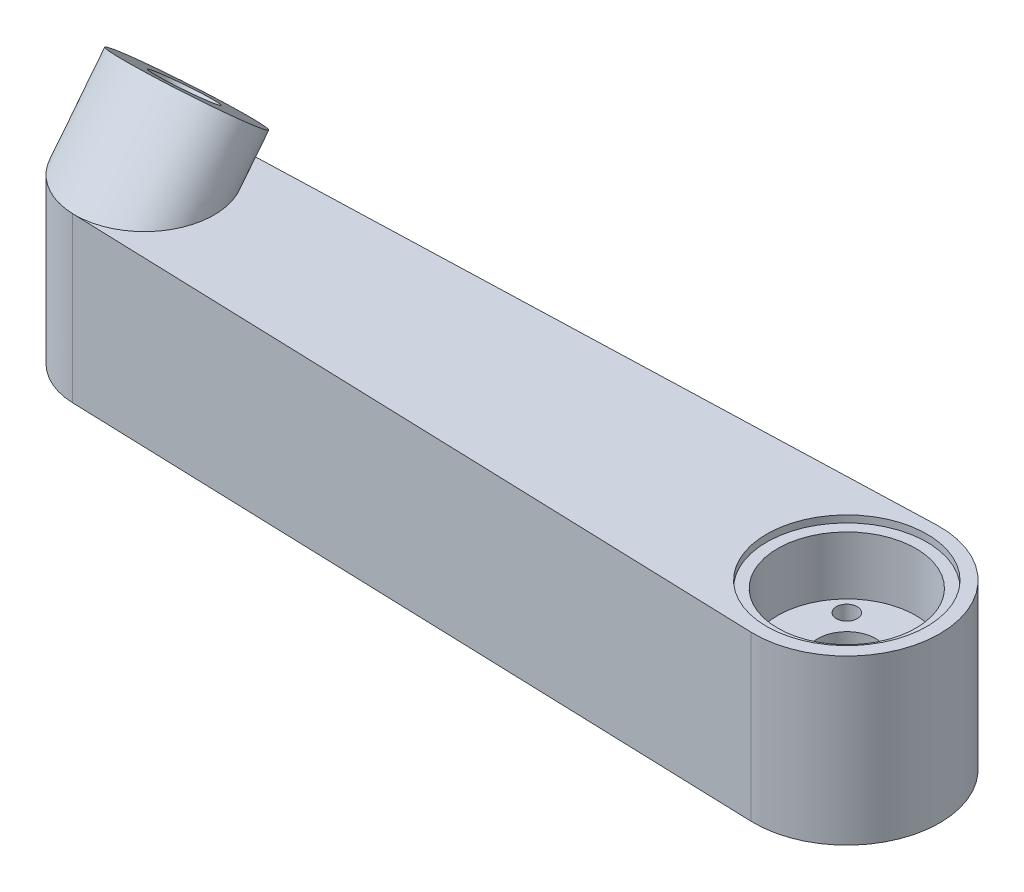
ISO-10303-21;
HEADER;
FILE_DESCRIPTION(('STEP AP214'),'2;1');
FILE_NAME('part.step','',(''),(''),'','','');
FILE_SCHEMA(('AUTOMOTIVE_DESIGN { 1 0 10303 214 1 1 1 1 }'));
ENDSEC;
DATA;
#1=APPLICATION_CONTEXT('core data for automotive mechanical design processes');
#2=APPLICATION_PROTOCOL_DEFINITION('international standard','automotive_design',2000,#1);
#3=PRODUCT_CONTEXT('',#1,'mechanical');
#4=PRODUCT('Part','Part','',(#3));
#5=PRODUCT_RELATED_PRODUCT_CATEGORY('part','',(#4));
#6=PRODUCT_DEFINITION_FORMATION('','',#4);
#7=PRODUCT_DEFINITION_CONTEXT('part definition',#1,'design');
#8=PRODUCT_DEFINITION('design','',#6,#7);
#9=PRODUCT_DEFINITION_SHAPE('','',#8);
#10=(LENGTH_UNIT() NAMED_UNIT(*) SI_UNIT(.MILLI.,.METRE.));
#11=(NAMED_UNIT(*) PLANE_ANGLE_UNIT() SI_UNIT($,.RADIAN.));
#12=(NAMED_UNIT(*) SI_UNIT($,.STERADIAN.) SOLID_ANGLE_UNIT());
#13=UNCERTAINTY_MEASURE_WITH_UNIT(LENGTH_MEASURE(1.E-05),#10,'distance_accuracy_value','');
#14=(GEOMETRIC_REPRESENTATION_CONTEXT(3) GLOBAL_UNCERTAINTY_ASSIGNED_CONTEXT((#13)) GLOBAL_UNIT_ASSIGNED_CONTEXT((#10,
#11,#12)) REPRESENTATION_CONTEXT('',''));
#15=CARTESIAN_POINT('',(0.,0.,0.));
#16=DIRECTION('',(0.,0.,1.));
#17=DIRECTION('',(1.,0.,0.));
#18=AXIS2_PLACEMENT_3D('',#15,#16,#17);
#19=CARTESIAN_POINT('',(-1.65047615234204,14.11,0.));
#20=DIRECTION('',(0.,1.,0.));
#21=DIRECTION('',(0.,0.,1.));
#22=AXIS2_PLACEMENT_3D('',#19,#20,#21);
#23=PLANE('',#22);
#24=CARTESIAN_POINT('',(-1.65047615234204,14.11,0.));
#25=DIRECTION('',(0.,1.,0.));
#26=DIRECTION('',(0.,0.,1.));
#27=AXIS2_PLACEMENT_3D('',#24,#25,#26);
#28=CIRCLE('',#27,6.9);
#29=CARTESIAN_POINT('',(-1.65047615234204,14.11,6.9));
#30=VERTEX_POINT('',#29);
#31=EDGE_CURVE('E247',#30,#30,#28,.T.);
#32=ORIENTED_EDGE('',*,*,#31,.F.);
#33=EDGE_LOOP('',(#32));
#34=FACE_BOUND('',#33,.T.);
#35=DIRECTION('',(-0.999453439871721,0.,0.0330578512396694));
#36=VECTOR('',#35,1.);
#37=CARTESIAN_POINT('',(-62.3488232597801,14.11,-5.99672063923033));
#38=LINE('',#37,#36);
#39=CARTESIAN_POINT('',(-1.91493896225939,14.11,-7.99562751897377));
#40=VERTEX_POINT('',#39);
#41=CARTESIAN_POINT('',(-62.3488232597801,14.11,-5.99672063923033));
#42=VERTEX_POINT('',#41);
#43=EDGE_CURVE('E147',#40,#42,#38,.T.);
#44=ORIENTED_EDGE('',*,*,#43,.T.);
#45=CARTESIAN_POINT('',(-68.1471967915724,14.11,0.198347107438119));
#46=CARTESIAN_POINT('',(-68.1520661843634,14.11,0.0511553282352562));
#47=CARTESIAN_POINT('',(-68.1515121963934,14.11,-0.0962002275383863));
#48=CARTESIAN_POINT('',(-68.1395691386214,14.11,-0.390426775860385));
#49=CARTESIAN_POINT('',(-68.1281838321258,14.11,-0.537297918931526));
#50=CARTESIAN_POINT('',(-68.0946434247732,14.11,-0.829778387416431));
#51=CARTESIAN_POINT('',(-68.0724906600901,14.11,-0.975387979572081));
#52=CARTESIAN_POINT('',(-68.0175300864817,14.11,-1.26467124292174));
#53=CARTESIAN_POINT('',(-67.9847139657775,14.11,-1.40834331259123));
#54=CARTESIAN_POINT('',(-67.8697041533749,14.11,-1.83817835365446));
#55=CARTESIAN_POINT('',(-67.7712908059994,14.11,-2.12017498374659));
#56=CARTESIAN_POINT('',(-67.5336703268179,14.11,-2.66645115116667));
#57=CARTESIAN_POINT('',(-67.3944575816791,14.11,-2.9307282444229));
#58=CARTESIAN_POINT('',(-67.1482842114118,14.11,-3.32410173548775));
#59=CARTESIAN_POINT('',(-67.054187176081,14.11,-3.46140238156312));
#60=CARTESIAN_POINT('',(-66.8549741393181,14.11,-3.72763925572838));
#61=CARTESIAN_POINT('',(-66.7498665988274,14.11,-3.8565817849798));
#62=CARTESIAN_POINT('',(-66.5292832151012,14.11,-4.10532561793325));
#63=CARTESIAN_POINT('',(-66.4138043852355,14.11,-4.22512426997322));
#64=CARTESIAN_POINT('',(-66.1732751266894,14.11,-4.45474300468774));
#65=CARTESIAN_POINT('',(-66.048222925387,14.11,-4.56456123109628));
#66=CARTESIAN_POINT('',(-65.7894660538042,14.11,-4.77340430217863));
#67=CARTESIAN_POINT('',(-65.6557637447259,14.11,-4.87243207265495));
#68=CARTESIAN_POINT('',(-65.3805496669889,14.11,-5.05907892826204));
#69=CARTESIAN_POINT('',(-65.2390351183588,14.11,-5.14669391442633));
#70=CARTESIAN_POINT('',(-64.9492702893459,14.11,-5.30983865826737));
#71=CARTESIAN_POINT('',(-64.801022441055,14.11,-5.38537273573363));
#72=CARTESIAN_POINT('',(-64.4987131340798,14.11,-5.5238969840342));
#73=CARTESIAN_POINT('',(-64.3446496083553,14.11,-5.58688264394521));
#74=CARTESIAN_POINT('',(-64.0318798855268,14.11,-5.69982062044537));
#75=CARTESIAN_POINT('',(-63.8731753737037,14.11,-5.74977760435157));
#76=CARTESIAN_POINT('',(-63.5521089639096,14.11,-5.83635847941514));
#77=CARTESIAN_POINT('',(-63.3897457738244,14.11,-5.87297757918927));
#78=CARTESIAN_POINT('',(-63.0625978046556,14.11,-5.9325938000603));
#79=CARTESIAN_POINT('',(-62.8978139152139,14.11,-5.95559580333154));
#80=CARTESIAN_POINT('',(-62.566845852174,14.11,-5.98784528141334));
#81=CARTESIAN_POINT('',(-62.4006611972648,14.11,-5.99708781703348));
#82=CARTESIAN_POINT('',(-62.068158169307,14.11,-6.00173798606311));
#83=CARTESIAN_POINT('',(-61.9018398656182,14.11,-5.99715058157522));
#84=CARTESIAN_POINT('',(-61.5700986984763,14.11,-5.97417917837395));
#85=CARTESIAN_POINT('',(-61.4046761778,14.11,-5.955790228925));
#86=CARTESIAN_POINT('',(-61.075988975103,14.11,-5.90534608631024));
#87=CARTESIAN_POINT('',(-60.9127235402447,14.11,-5.8732957982978));
#88=CARTESIAN_POINT('',(-60.5893591453957,14.11,-5.79573710332624));
#89=CARTESIAN_POINT('',(-60.4292613428185,14.11,-5.75022387064067));
#90=CARTESIAN_POINT('',(-60.1134555882603,14.11,-5.64607670806484));
#91=CARTESIAN_POINT('',(-59.9577460820183,14.11,-5.5874474911033));
#92=CARTESIAN_POINT('',(-59.6516773505297,14.11,-5.45744077659137));
#93=CARTESIAN_POINT('',(-59.5013200654482,14.11,-5.38605871148482));
#94=CARTESIAN_POINT('',(-59.2071058796659,14.11,-5.23108068300924));
#95=CARTESIAN_POINT('',(-59.0632466662931,14.11,-5.14748911058275));
#96=CARTESIAN_POINT('',(-58.7829162513688,14.11,-4.96862150448562));
#97=CARTESIAN_POINT('',(-58.6464477197579,14.11,-4.87334128825769));
#98=CARTESIAN_POINT('',(-58.381936712407,14.11,-4.67180179886411));
#99=CARTESIAN_POINT('',(-58.2538912313698,14.11,-4.56554647671548));
#100=CARTESIAN_POINT('',(-58.0070430313702,14.11,-4.34277041926882));
#101=CARTESIAN_POINT('',(-57.8882436459451,14.11,-4.22624601360094));
#102=CARTESIAN_POINT('',(-57.5470841944294,14.11,-3.8625139479802));
#103=CARTESIAN_POINT('',(-57.3396837459768,14.11,-3.60093441143771));
#104=CARTESIAN_POINT('',(-56.9711518602716,14.11,-3.04719076425182));
#105=CARTESIAN_POINT('',(-56.810020423019,14.11,-2.75502665360843));
#106=CARTESIAN_POINT('',(-56.5383023752105,14.11,-2.14802412058735));
#107=CARTESIAN_POINT('',(-56.4277157646547,14.11,-1.83318569820966));
#108=CARTESIAN_POINT('',(-56.2601826225626,14.11,-1.18955787510422));
#109=CARTESIAN_POINT('',(-56.2032360910264,14.11,-0.860768474376483));
#110=CARTESIAN_POINT('',(-56.1445416843908,14.11,-0.198296524990587));
#111=CARTESIAN_POINT('',(-56.1427938092914,14.11,0.135386023667567));
#112=CARTESIAN_POINT('',(-56.1945481419429,14.11,0.798438001954646));
#113=CARTESIAN_POINT('',(-56.2480503496936,14.11,1.12780743158357));
#114=CARTESIAN_POINT('',(-56.4088283991795,14.11,1.77314948413628));
#115=CARTESIAN_POINT('',(-56.5161042409146,14.11,2.08912210706006));
#116=CARTESIAN_POINT('',(-56.7814706685639,14.11,2.69895536711243));
#117=CARTESIAN_POINT('',(-56.939561254478,14.11,2.99281600424101));
#118=CARTESIAN_POINT('',(-57.3021979083071,14.11,3.55032034876061));
#119=CARTESIAN_POINT('',(-57.5067439762221,14.11,3.81396405615163));
#120=CARTESIAN_POINT('',(-57.9566456485289,14.11,4.30376258855954));
#121=CARTESIAN_POINT('',(-58.2020012529208,14.11,4.52991741357643));
#122=CARTESIAN_POINT('',(-58.7267708151678,14.11,4.93850159696324));
#123=CARTESIAN_POINT('',(-59.0061847730229,14.11,5.12093095533315));
#124=CARTESIAN_POINT('',(-59.5913044817909,14.11,5.4370285652733));
#125=CARTESIAN_POINT('',(-59.8970102327037,14.11,5.57069681684353));
#126=CARTESIAN_POINT('',(-60.5265054658597,14.11,5.78560035105036));
#127=CARTESIAN_POINT('',(-60.8502949481029,14.11,5.86683563368695));
#128=CARTESIAN_POINT('',(-61.3423890625995,14.11,5.94766984300878));
#129=CARTESIAN_POINT('',(-61.5075765237426,14.11,5.96777789549279));
#130=CARTESIAN_POINT('',(-61.8390344794966,14.11,5.99421327296285));
#131=CARTESIAN_POINT('',(-62.0053045643073,14.11,6.00054553921893));
#132=CARTESIAN_POINT('',(-62.3378446084273,14.11,5.9993802704831));
#133=CARTESIAN_POINT('',(-62.5041145462768,14.11,5.99187777143176));
#134=CARTESIAN_POINT('',(-62.835400445196,14.11,5.96309556825293));
#135=CARTESIAN_POINT('',(-63.0004168347325,14.11,5.94182080768531));
#136=CARTESIAN_POINT('',(-63.3281716804609,14.11,5.88563417647897));
#137=CARTESIAN_POINT('',(-63.4909092978939,14.11,5.85071741448976));
#138=CARTESIAN_POINT('',(-63.8128647161773,14.11,5.76750369657232));
#139=CARTESIAN_POINT('',(-63.9720837588227,14.11,5.71921154530358));
#140=CARTESIAN_POINT('',(-64.2860191393127,14.11,5.60955534188984));
#141=CARTESIAN_POINT('',(-64.4407338407194,14.11,5.54818660471913));
#142=CARTESIAN_POINT('',(-64.7444772951138,14.11,5.41283596044297));
#143=CARTESIAN_POINT('',(-64.89350806803,14.11,5.33885858622558));
#144=CARTESIAN_POINT('',(-65.1849656249351,14.11,5.17875742746718));
#145=CARTESIAN_POINT('',(-65.3273900197112,14.11,5.09262929338866));
#146=CARTESIAN_POINT('',(-65.6045437442249,14.11,4.90887483802792));
#147=CARTESIAN_POINT('',(-65.7392758161987,14.11,4.81125265274709));
#148=CARTESIAN_POINT('',(-66.0002167787745,14.11,4.60512235854356));
#149=CARTESIAN_POINT('',(-66.1264225936988,14.11,4.49661035604906));
#150=CARTESIAN_POINT('',(-66.3693423020739,14.11,4.26952029553528));
#151=CARTESIAN_POINT('',(-66.4860595835452,14.11,4.1509458616395));
#152=CARTESIAN_POINT('',(-66.7092867868678,14.11,3.90447183125185));
#153=CARTESIAN_POINT('',(-66.8157930393663,14.11,3.77656891140581));
#154=CARTESIAN_POINT('',(-67.0177786467934,14.11,3.51240685555703));
#155=CARTESIAN_POINT('',(-67.1132619261399,14.11,3.37615072009641));
#156=CARTESIAN_POINT('',(-67.2926173103556,14.11,3.09613262546256));
#157=CARTESIAN_POINT('',(-67.3764854474698,14.11,2.95236812439861));
#158=CARTESIAN_POINT('',(-67.5319656782743,14.11,2.65842226220991));
#159=CARTESIAN_POINT('',(-67.6035817361024,14.11,2.50824299629816));
#160=CARTESIAN_POINT('',(-67.7402861427434,14.11,2.1879536183892));
#161=CARTESIAN_POINT('',(-67.8041129676212,14.11,2.01730333890915));
#162=CARTESIAN_POINT('',(-67.915972755906,14.11,1.67097430308339));
#163=CARTESIAN_POINT('',(-67.9640111776156,14.11,1.49529730743443));
#164=CARTESIAN_POINT('',(-68.0453465853963,14.11,1.13401497162116));
#165=CARTESIAN_POINT('',(-68.0780613342867,14.11,0.948278345818862));
#166=CARTESIAN_POINT('',(-68.1258714925853,14.11,0.574565930804265));
#167=CARTESIAN_POINT('',(-68.1409693324027,14.11,0.386590454076896));
#168=CARTESIAN_POINT('',(-68.1471967915724,14.11,0.198347107438119));
#169=B_SPLINE_CURVE_WITH_KNOTS('',3,(#45,#46,#47,#48,#49,#50,#51,#52,#53,#54,#55,#56,#57,#58,
#59,#60,#61,#62,#63,#64,#65,#66,#67,#68,#69,#70,#71,#72,#73,#74,#75,#76,#77,#78,#79,#80,#81,#82,
#83,#84,#85,#86,#87,#88,#89,#90,#91,#92,#93,#94,#95,#96,#97,#98,#99,#100,#101,#102,#103,#104,
#105,#106,#107,#108,#109,#110,#111,#112,#113,#114,#115,#116,#117,#118,#119,#120,#121,#122,#123,
#124,#125,#126,#127,#128,#129,#130,#131,#132,#133,#134,#135,#136,#137,#138,#139,#140,#141,#142,
#143,#144,#145,#146,#147,#148,#149,#150,#151,#152,#153,#154,#155,#156,#157,#158,#159,#160,#161,
#162,#163,#164,#165,#166,#167,#168),.UNSPECIFIED.,.T.,.F.,(4,2,2,2,2,2,2,2,2,2,2,2,2,2,2,2,2,2,
2,2,2,2,2,2,2,2,2,2,2,2,2,2,2,2,2,2,2,2,2,2,2,2,2,2,2,2,2,2,2,2,2,2,2,2,2,2,2,2,2,2,2,4),(0.,
0.441689269997099,0.883225132523402,1.32466523945413,1.76645026497406,2.65894588078218,
3.55156434714494,4.05041444936177,4.54888398750575,5.04749753350187,5.5462036279825,
6.04477416140674,6.5435232684384,7.04209363632608,7.54084290889411,8.03941326624042,
8.53816254934972,9.03673290606388,9.53548218980527,10.0340525464842,10.5328018302608,
11.0313721869381,11.5301214707164,12.0286918273937,12.5274411111721,13.0260114678495,
13.5247607516279,14.0233311083048,14.5220803920838,15.5185385663628,16.5149967406417,
17.5114549149206,18.5079130891995,19.5043712634784,20.5008294377574,21.4972876120363,
22.4937457863152,23.4902039605941,24.486662134873,25.483120309152,26.4795784834309,
27.4760366577098,27.9747859414888,28.4733562981653,28.9721055819434,29.4706759386209,
29.9694252223934,30.4679955790765,30.9667448627544,31.4653152195322,31.9640645016595,
32.462634859988,32.9613841178076,33.4599545004439,33.9587033789885,34.4572741409001,
34.9560147976635,35.454593781361,36.0004152538649,36.5460478282145,37.111001525695,
37.6758772735729),.UNSPECIFIED.);
#170=CARTESIAN_POINT('',(-62.3488232597801,14.11,5.99672063923033));
#171=VERTEX_POINT('',#170);
#172=EDGE_CURVE('E146',#42,#171,#169,.T.);
#173=ORIENTED_EDGE('',*,*,#172,.T.);
#174=DIRECTION('',(0.999453439871721,0.,0.0330578512396694));
#175=VECTOR('',#174,1.);
#176=CARTESIAN_POINT('',(-62.3488232597801,14.11,5.99672063923033));
#177=LINE('',#176,#175);
#178=CARTESIAN_POINT('',(-1.9149389622594,14.11,7.99562751897377));
#179=VERTEX_POINT('',#178);
#180=EDGE_CURVE('E124',#171,#179,#177,.T.);
#181=ORIENTED_EDGE('',*,*,#180,.T.);
#182=CARTESIAN_POINT('',(-1.65047615234204,14.11,0.));
#183=DIRECTION('',(0.,1.,0.));
#184=DIRECTION('',(0.,0.,1.));
#185=AXIS2_PLACEMENT_3D('',#182,#183,#184);
#186=CIRCLE('',#185,8.);
#187=EDGE_CURVE('E156',#179,#40,#186,.T.);
#188=ORIENTED_EDGE('',*,*,#187,.T.);
#189=EDGE_LOOP('',(#44,#173,#181,#188));
#190=FACE_BOUND('',#189,.T.);
#191=ADVANCED_FACE('F33',(#34,#190),#23,.T.);
#192=CARTESIAN_POINT('',(-1.65047615234204,2.5,0.));
#193=DIRECTION('',(0.,-1.,0.));
#194=DIRECTION('',(0.,0.,-1.));
#195=AXIS2_PLACEMENT_3D('',#192,#193,#194);
#196=PLANE('',#195);
#197=CARTESIAN_POINT('',(-1.65047615234204,2.5,0.));
#198=DIRECTION('',(0.,-1.,0.));
#199=DIRECTION('',(0.,0.,-1.));
#200=AXIS2_PLACEMENT_3D('',#197,#198,#199);
#201=CIRCLE('',#200,2.5);
#202=CARTESIAN_POINT('',(0.757686140271016,2.5,-0.671382433815952));
#203=VERTEX_POINT('',#202);
#204=CARTESIAN_POINT('',(-3.78029224303496,2.5,-1.30915370366718));
#205=VERTEX_POINT('',#204);
#206=EDGE_CURVE('E182',#203,#205,#201,.F.);
#207=ORIENTED_EDGE('',*,*,#206,.T.);
#208=DIRECTION('',(0.99026806874157,0.,0.139173100960066));
#209=VECTOR('',#208,1.);
#210=CARTESIAN_POINT('',(-7.36980795271308,2.5,-1.8136272376827));
#211=LINE('',#210,#209);
#212=CARTESIAN_POINT('',(-7.36980795271308,2.5,-1.8136272376827));
#213=VERTEX_POINT('',#212);
#214=EDGE_CURVE('E150',#213,#205,#211,.T.);
#215=ORIENTED_EDGE('',*,*,#214,.F.);
#216=CARTESIAN_POINT('',(-1.65047615234204,2.5,0.));
#217=DIRECTION('',(0.,-1.,0.));
#218=DIRECTION('',(0.,0.,-1.));
#219=AXIS2_PLACEMENT_3D('',#216,#217,#218);
#220=CIRCLE('',#219,6.);
#221=CARTESIAN_POINT('',(4.34720184994913,2.5,-0.16690889980044));
#222=VERTEX_POINT('',#221);
#223=EDGE_CURVE('E263',#213,#222,#220,.T.);
#224=ORIENTED_EDGE('',*,*,#223,.T.);
#225=DIRECTION('',(0.99026806874157,0.,0.139173100960066));
#226=VECTOR('',#225,1.);
#227=CARTESIAN_POINT('',(0.757686140271016,2.5,-0.671382433815952));
#228=LINE('',#227,#226);
#229=EDGE_CURVE('E278',#203,#222,#228,.T.);
#230=ORIENTED_EDGE('',*,*,#229,.F.);
#231=EDGE_LOOP('',(#207,#215,#224,#230));
#232=FACE_BOUND('',#231,.T.);
#233=ADVANCED_FACE('F213',(#232),#196,.T.);
#234=CARTESIAN_POINT('',(4.068855648029,2.5,1.8136272376827));
#235=VERTEX_POINT('',#234);
#236=CARTESIAN_POINT('',(-7.64815415463321,2.5,0.166908899800477));
#237=VERTEX_POINT('',#236);
#238=EDGE_CURVE('E265',#235,#237,#220,.T.);
#239=ORIENTED_EDGE('',*,*,#238,.T.);
#240=DIRECTION('',(-0.990268068741571,0.,-0.139173100960063));
#241=VECTOR('',#240,1.);
#242=CARTESIAN_POINT('',(-7.64815415463321,2.5,0.166908899800477));
#243=LINE('',#242,#241);
#244=CARTESIAN_POINT('',(-4.05863844495509,2.5,0.67138243381598));
#245=VERTEX_POINT('',#244);
#246=EDGE_CURVE('E303',#245,#237,#243,.T.);
#247=ORIENTED_EDGE('',*,*,#246,.F.);
#248=CARTESIAN_POINT('',(0.479339938350876,2.5,1.3091537036672));
#249=VERTEX_POINT('',#248);
#250=EDGE_CURVE('E185',#245,#249,#201,.F.);
#251=ORIENTED_EDGE('',*,*,#250,.T.);
#252=DIRECTION('',(-0.990268068741571,0.,-0.139173100960064));
#253=VECTOR('',#252,1.);
#254=CARTESIAN_POINT('',(0.479339938350876,2.5,1.3091537036672));
#255=LINE('',#254,#253);
#256=EDGE_CURVE('E282',#235,#249,#255,.T.);
#257=ORIENTED_EDGE('',*,*,#256,.F.);
#258=EDGE_LOOP('',(#239,#247,#251,#257));
#259=FACE_BOUND('',#258,.T.);
#260=ADVANCED_FACE('F219',(#259),#196,.T.);
#261=CARTESIAN_POINT('',(-1.65047615234204,2.5,0.));
#262=DIRECTION('',(0.,-1.,0.));
#263=DIRECTION('',(0.,0.,-1.));
#264=AXIS2_PLACEMENT_3D('',#261,#262,#263);
#265=CYLINDRICAL_SURFACE('',#264,6.);
#266=CARTESIAN_POINT('',(-1.65047615234204,0.,0.));
#267=DIRECTION('',(0.,-1.,0.));
#268=DIRECTION('',(0.,0.,-1.));
#269=AXIS2_PLACEMENT_3D('',#266,#267,#268);
#270=CIRCLE('',#269,6.);
#271=CARTESIAN_POINT('',(-1.65047615234204,0.,-6.));
#272=VERTEX_POINT('',#271);
#273=EDGE_CURVE('E260',#272,#272,#270,.T.);
#274=ORIENTED_EDGE('',*,*,#273,.T.);
#275=EDGE_LOOP('',(#274));
#276=FACE_BOUND('',#275,.T.);
#277=DIRECTION('',(0.,1.,0.));
#278=VECTOR('',#277,1.);
#279=CARTESIAN_POINT('',(-7.36980795271308,2.1,-1.8136272376827));
#280=LINE('',#279,#278);
#281=CARTESIAN_POINT('',(-7.36980795271308,2.1,-1.8136272376827));
#282=VERTEX_POINT('',#281);
#283=EDGE_CURVE('E55',#282,#213,#280,.T.);
#284=ORIENTED_EDGE('',*,*,#283,.F.);
#285=CARTESIAN_POINT('',(-1.65047615234204,2.1,0.));
#286=DIRECTION('',(0.,-1.,0.));
#287=DIRECTION('',(0.,0.,-1.));
#288=AXIS2_PLACEMENT_3D('',#285,#286,#287);
#289=CIRCLE('',#288,6.);
#290=CARTESIAN_POINT('',(-7.64815415463321,2.1,0.166908899800477));
#291=VERTEX_POINT('',#290);
#292=EDGE_CURVE('E50',#291,#282,#289,.T.);
#293=ORIENTED_EDGE('',*,*,#292,.F.);
#294=DIRECTION('',(0.,1.,0.));
#295=VECTOR('',#294,1.);
#296=CARTESIAN_POINT('',(-7.64815415463321,2.1,0.166908899800477));
#297=LINE('',#296,#295);
#298=EDGE_CURVE('E300',#291,#237,#297,.T.);
#299=ORIENTED_EDGE('',*,*,#298,.T.);
#300=ORIENTED_EDGE('',*,*,#238,.F.);
#301=DIRECTION('',(0.,1.,0.));
#302=VECTOR('',#301,1.);
#303=CARTESIAN_POINT('',(4.068855648029,2.1,1.8136272376827));
#304=LINE('',#303,#302);
#305=CARTESIAN_POINT('',(4.068855648029,2.1,1.8136272376827));
#306=VERTEX_POINT('',#305);
#307=EDGE_CURVE('E264',#306,#235,#304,.T.);
#308=ORIENTED_EDGE('',*,*,#307,.F.);
#309=CARTESIAN_POINT('',(-1.65047615234204,2.1,0.));
#310=DIRECTION('',(0.,-1.,0.));
#311=DIRECTION('',(0.,0.,-1.));
#312=AXIS2_PLACEMENT_3D('',#309,#310,#311);
#313=CIRCLE('',#312,6.);
#314=CARTESIAN_POINT('',(4.34720184994913,2.1,-0.16690889980044));
#315=VERTEX_POINT('',#314);
#316=EDGE_CURVE('E281',#315,#306,#313,.T.);
#317=ORIENTED_EDGE('',*,*,#316,.F.);
#318=DIRECTION('',(0.,1.,0.));
#319=VECTOR('',#318,1.);
#320=CARTESIAN_POINT('',(4.34720184994913,2.1,-0.16690889980044));
#321=LINE('',#320,#319);
#322=EDGE_CURVE('E274',#315,#222,#321,.T.);
#323=ORIENTED_EDGE('',*,*,#322,.T.);
#324=ORIENTED_EDGE('',*,*,#223,.F.);
#325=EDGE_LOOP('',(#284,#293,#299,#300,#308,#317,#323,#324));
#326=FACE_BOUND('',#325,.T.);
#327=ADVANCED_FACE('F433',(#276,#326),#265,.F.);
#328=CARTESIAN_POINT('',(-1.65047615234204,0.,0.));
#329=DIRECTION('',(0.,1.,0.));
#330=DIRECTION('',(0.,0.,1.));
#331=AXIS2_PLACEMENT_3D('',#328,#329,#330);
#332=CYLINDRICAL_SURFACE('',#331,2.5);
#333=CARTESIAN_POINT('',(-1.65047615234204,8.51,0.));
#334=DIRECTION('',(0.,1.,0.));
#335=DIRECTION('',(0.,0.,1.));
#336=AXIS2_PLACEMENT_3D('',#333,#334,#335);
#337=CIRCLE('',#336,2.5);
#338=CARTESIAN_POINT('',(-1.65047615234204,8.51,2.5));
#339=VERTEX_POINT('',#338);
#340=EDGE_CURVE('E250',#339,#339,#337,.T.);
#341=ORIENTED_EDGE('',*,*,#340,.T.);
#342=EDGE_LOOP('',(#341));
#343=FACE_BOUND('',#342,.T.);
#344=ORIENTED_EDGE('',*,*,#206,.F.);
#345=DIRECTION('',(0.,1.,0.));
#346=VECTOR('',#345,1.);
#347=CARTESIAN_POINT('',(0.757686140271016,2.1,-0.671382433815952));
#348=LINE('',#347,#346);
#349=CARTESIAN_POINT('',(0.757686140271016,2.1,-0.671382433815952));
#350=VERTEX_POINT('',#349);
#351=EDGE_CURVE('E272',#350,#203,#348,.T.);
#352=ORIENTED_EDGE('',*,*,#351,.F.);
#353=CARTESIAN_POINT('',(-1.65047615234204,2.1,0.));
#354=DIRECTION('',(0.,1.,0.));
#355=DIRECTION('',(0.,0.,-1.));
#356=AXIS2_PLACEMENT_3D('',#353,#354,#355);
#357=CIRCLE('',#356,2.5);
#358=CARTESIAN_POINT('',(0.479339938350876,2.1,1.3091537036672));
#359=VERTEX_POINT('',#358);
#360=EDGE_CURVE('E287',#359,#350,#357,.T.);
#361=ORIENTED_EDGE('',*,*,#360,.F.);
#362=DIRECTION('',(0.,1.,0.));
#363=VECTOR('',#362,1.);
#364=CARTESIAN_POINT('',(0.479339938350876,2.1,1.3091537036672));
#365=LINE('',#364,#363);
#366=EDGE_CURVE('E269',#359,#249,#365,.T.);
#367=ORIENTED_EDGE('',*,*,#366,.T.);
#368=ORIENTED_EDGE('',*,*,#250,.F.);
#369=DIRECTION('',(0.,1.,0.));
#370=VECTOR('',#369,1.);
#371=CARTESIAN_POINT('',(-4.05863844495509,2.1,0.67138243381598));
#372=LINE('',#371,#370);
#373=CARTESIAN_POINT('',(-4.05863844495509,2.1,0.67138243381598));
#374=VERTEX_POINT('',#373);
#375=EDGE_CURVE('E297',#374,#245,#372,.T.);
#376=ORIENTED_EDGE('',*,*,#375,.F.);
#377=CARTESIAN_POINT('',(-1.65047615234204,2.1,0.));
#378=DIRECTION('',(0.,1.,0.));
#379=DIRECTION('',(0.,0.,-1.));
#380=AXIS2_PLACEMENT_3D('',#377,#378,#379);
#381=CIRCLE('',#380,2.5);
#382=CARTESIAN_POINT('',(-3.78029224303496,2.1,-1.30915370366718));
#383=VERTEX_POINT('',#382);
#384=EDGE_CURVE('E309',#383,#374,#381,.T.);
#385=ORIENTED_EDGE('',*,*,#384,.F.);
#386=DIRECTION('',(0.,1.,0.));
#387=VECTOR('',#386,1.);
#388=CARTESIAN_POINT('',(-3.78029224303496,2.1,-1.30915370366718));
#389=LINE('',#388,#387);
#390=EDGE_CURVE('E294',#383,#205,#389,.T.);
#391=ORIENTED_EDGE('',*,*,#390,.T.);
#392=EDGE_LOOP('',(#344,#352,#361,#367,#368,#376,#385,#391));
#393=FACE_BOUND('',#392,.T.);
#394=ADVANCED_FACE('F239',(#343,#393),#332,.F.);
#395=CARTESIAN_POINT('',(-1.65047615234204,14.11,0.));
#396=DIRECTION('',(0.,-1.,0.));
#397=DIRECTION('',(0.,0.,-1.));
#398=AXIS2_PLACEMENT_3D('',#395,#396,#397);
#399=CYLINDRICAL_SURFACE('',#398,8.);
#400=CARTESIAN_POINT('',(-1.65047615234204,0.,0.));
#401=DIRECTION('',(0.,1.,0.));
#402=DIRECTION('',(0.,0.,1.));
#403=AXIS2_PLACEMENT_3D('',#400,#401,#402);
#404=CIRCLE('',#403,8.);
#405=CARTESIAN_POINT('',(-1.9149389622594,0.,7.99562751897377));
#406=VERTEX_POINT('',#405);
#407=CARTESIAN_POINT('',(-1.91493896225939,0.,-7.99562751897377));
#408=VERTEX_POINT('',#407);
#409=EDGE_CURVE('E172',#406,#408,#404,.T.);
#410=ORIENTED_EDGE('',*,*,#409,.T.);
#411=DIRECTION('',(0.,-1.,0.));
#412=VECTOR('',#411,1.);
#413=CARTESIAN_POINT('',(-1.91493896225939,14.11,-7.99562751897377));
#414=LINE('',#413,#412);
#415=EDGE_CURVE('E11',#40,#408,#414,.T.);
#416=ORIENTED_EDGE('',*,*,#415,.F.);
#417=ORIENTED_EDGE('',*,*,#187,.F.);
#418=DIRECTION('',(0.,-1.,0.));
#419=VECTOR('',#418,1.);
#420=CARTESIAN_POINT('',(-1.9149389622594,14.11,7.99562751897377));
#421=LINE('',#420,#419);
#422=EDGE_CURVE('E130',#179,#406,#421,.T.);
#423=ORIENTED_EDGE('',*,*,#422,.T.);
#424=EDGE_LOOP('',(#410,#416,#417,#423));
#425=FACE_BOUND('',#424,.T.);
#426=ADVANCED_FACE('F35',(#425),#399,.T.);
#427=CARTESIAN_POINT('',(-62.3488232597801,14.11,-5.99672063923033));
#428=DIRECTION('',(0.0330578512396694,0.,0.999453439871721));
#429=DIRECTION('',(0.999453439871721,0.,-0.0330578512396694));
#430=AXIS2_PLACEMENT_3D('',#427,#428,#429);
#431=PLANE('',#430);
#432=DIRECTION('',(-0.999453439871721,0.,0.0330578512396694));
#433=VECTOR('',#432,1.);
#434=CARTESIAN_POINT('',(-62.3488232597801,0.,-5.99672063923033));
#435=LINE('',#434,#433);
#436=CARTESIAN_POINT('',(-62.3488232597801,0.,-5.99672063923033));
#437=VERTEX_POINT('',#436);
#438=EDGE_CURVE('E168',#408,#437,#435,.T.);
#439=ORIENTED_EDGE('',*,*,#438,.T.);
#440=DIRECTION('',(0.,-1.,0.));
#441=VECTOR('',#440,1.);
#442=CARTESIAN_POINT('',(-62.3488232597801,14.11,-5.99672063923033));
#443=LINE('',#442,#441);
#444=EDGE_CURVE('E42',#42,#437,#443,.T.);
#445=ORIENTED_EDGE('',*,*,#444,.F.);
#446=ORIENTED_EDGE('',*,*,#43,.F.);
#447=ORIENTED_EDGE('',*,*,#415,.T.);
#448=EDGE_LOOP('',(#439,#445,#446,#447));
#449=FACE_BOUND('',#448,.T.);
#450=ADVANCED_FACE('F234',(#449),#431,.F.);
#451=CARTESIAN_POINT('',(-62.150476152342,14.11,0.));
#452=DIRECTION('',(0.,-1.,0.));
#453=DIRECTION('',(0.,0.,-1.));
#454=AXIS2_PLACEMENT_3D('',#451,#452,#453);
#455=CYLINDRICAL_SURFACE('',#454,6.);
#456=CARTESIAN_POINT('',(-62.150476152342,0.,0.));
#457=DIRECTION('',(0.,1.,0.));
#458=DIRECTION('',(0.,0.,1.));
#459=AXIS2_PLACEMENT_3D('',#456,#457,#458);
#460=CIRCLE('',#459,6.);
#461=CARTESIAN_POINT('',(-62.3488232597801,0.,5.99672063923033));
#462=VERTEX_POINT('',#461);
#463=EDGE_CURVE('E144',#437,#462,#460,.T.);
#464=ORIENTED_EDGE('',*,*,#463,.T.);
#465=DIRECTION('',(0.,-1.,0.));
#466=VECTOR('',#465,1.);
#467=CARTESIAN_POINT('',(-62.3488232597801,14.11,5.99672063923033));
#468=LINE('',#467,#466);
#469=EDGE_CURVE('E127',#171,#462,#468,.T.);
#470=ORIENTED_EDGE('',*,*,#469,.F.);
#471=CARTESIAN_POINT('',(-62.150476152342,14.11,0.));
#472=DIRECTION('',(0.,1.,0.));
#473=DIRECTION('',(0.,0.,1.));
#474=AXIS2_PLACEMENT_3D('',#471,#472,#473);
#475=CIRCLE('',#474,6.);
#476=EDGE_CURVE('E135',#42,#171,#475,.T.);
#477=ORIENTED_EDGE('',*,*,#476,.F.);
#478=ORIENTED_EDGE('',*,*,#444,.T.);
#479=EDGE_LOOP('',(#464,#470,#477,#478));
#480=FACE_BOUND('',#479,.T.);
#481=ADVANCED_FACE('F139',(#480),#455,.T.);
#482=CARTESIAN_POINT('',(-62.3488232597801,14.11,5.99672063923033));
#483=DIRECTION('',(0.0330578512396694,0.,-0.999453439871721));
#484=DIRECTION('',(-0.999453439871721,0.,-0.0330578512396694));
#485=AXIS2_PLACEMENT_3D('',#482,#483,#484);
#486=PLANE('',#485);
#487=DIRECTION('',(0.999453439871721,0.,0.0330578512396694));
#488=VECTOR('',#487,1.);
#489=CARTESIAN_POINT('',(-62.3488232597801,0.,5.99672063923033));
#490=LINE('',#489,#488);
#491=EDGE_CURVE('E169',#462,#406,#490,.T.);
#492=ORIENTED_EDGE('',*,*,#491,.T.);
#493=ORIENTED_EDGE('',*,*,#422,.F.);
#494=ORIENTED_EDGE('',*,*,#180,.F.);
#495=ORIENTED_EDGE('',*,*,#469,.T.);
#496=EDGE_LOOP('',(#492,#493,#494,#495));
#497=FACE_BOUND('',#496,.T.);
#498=ADVANCED_FACE('F126',(#497),#486,.F.);
#499=CARTESIAN_POINT('',(-1.65047615234204,0.,0.));
#500=DIRECTION('',(0.,1.,0.));
#501=DIRECTION('',(0.,0.,1.));
#502=AXIS2_PLACEMENT_3D('',#499,#500,#501);
#503=PLANE('',#502);
#504=ORIENTED_EDGE('',*,*,#273,.F.);
#505=EDGE_LOOP('',(#504));
#506=FACE_BOUND('',#505,.T.);
#507=ORIENTED_EDGE('',*,*,#409,.F.);
#508=ORIENTED_EDGE('',*,*,#491,.F.);
#509=ORIENTED_EDGE('',*,*,#463,.F.);
#510=ORIENTED_EDGE('',*,*,#438,.F.);
#511=EDGE_LOOP('',(#507,#508,#509,#510));
#512=FACE_BOUND('',#511,.T.);
#513=ADVANCED_FACE('F167',(#506,#512),#503,.F.);
#514=CARTESIAN_POINT('',(-1.65047615234204,13.51,0.));
#515=DIRECTION('',(0.,1.,0.));
#516=DIRECTION('',(0.,0.,1.));
#517=AXIS2_PLACEMENT_3D('',#514,#515,#516);
#518=PLANE('',#517);
#519=CARTESIAN_POINT('',(-1.65047615234204,13.51,0.));
#520=DIRECTION('',(0.,1.,0.));
#521=DIRECTION('',(0.,0.,1.));
#522=AXIS2_PLACEMENT_3D('',#519,#520,#521);
#523=CIRCLE('',#522,6.9);
#524=CARTESIAN_POINT('',(-1.65047615234204,13.51,6.9));
#525=VERTEX_POINT('',#524);
#526=EDGE_CURVE('E181',#525,#525,#523,.T.);
#527=ORIENTED_EDGE('',*,*,#526,.T.);
#528=EDGE_LOOP('',(#527));
#529=FACE_BOUND('',#528,.T.);
#530=CARTESIAN_POINT('',(-1.65047615234204,13.51,0.));
#531=DIRECTION('',(0.,1.,0.));
#532=DIRECTION('',(0.,0.,1.));
#533=AXIS2_PLACEMENT_3D('',#530,#531,#532);
#534=CIRCLE('',#533,5.95);
#535=CARTESIAN_POINT('',(-1.65047615234204,13.51,5.95));
#536=VERTEX_POINT('',#535);
#537=EDGE_CURVE('E177',#536,#536,#534,.F.);
#538=ORIENTED_EDGE('',*,*,#537,.T.);
#539=EDGE_LOOP('',(#538));
#540=FACE_BOUND('',#539,.T.);
#541=ADVANCED_FACE('F229',(#529,#540),#518,.T.);
#542=CARTESIAN_POINT('',(-1.65047615234204,13.51,0.));
#543=DIRECTION('',(0.,1.,0.));
#544=DIRECTION('',(0.,0.,1.));
#545=AXIS2_PLACEMENT_3D('',#542,#543,#544);
#546=CYLINDRICAL_SURFACE('',#545,6.9);
#547=ORIENTED_EDGE('',*,*,#526,.F.);
#548=EDGE_LOOP('',(#547));
#549=FACE_BOUND('',#548,.T.);
#550=ORIENTED_EDGE('',*,*,#31,.T.);
#551=EDGE_LOOP('',(#550));
#552=FACE_BOUND('',#551,.T.);
#553=ADVANCED_FACE('F495',(#549,#552),#546,.F.);
#554=CARTESIAN_POINT('',(-1.65047615234204,8.51,0.));
#555=DIRECTION('',(0.,1.,0.));
#556=DIRECTION('',(0.,0.,1.));
#557=AXIS2_PLACEMENT_3D('',#554,#555,#556);
#558=PLANE('',#557);
#559=CARTESIAN_POINT('',(-4.8324566676815,8.51,-3.18198051533946));
#560=DIRECTION('',(0.,1.,0.));
#561=DIRECTION('',(0.,0.,1.));
#562=AXIS2_PLACEMENT_3D('',#559,#560,#561);
#563=CIRCLE('',#562,0.9);
#564=CARTESIAN_POINT('',(-4.8324566676815,8.51,-2.28198051533946));
#565=VERTEX_POINT('',#564);
#566=EDGE_CURVE('E184',#565,#565,#563,.T.);
#567=ORIENTED_EDGE('',*,*,#566,.F.);
#568=EDGE_LOOP('',(#567));
#569=FACE_BOUND('',#568,.T.);
#570=ORIENTED_EDGE('',*,*,#340,.F.);
#571=EDGE_LOOP('',(#570));
#572=FACE_BOUND('',#571,.T.);
#573=CARTESIAN_POINT('',(-1.65047615234204,8.51,0.));
#574=DIRECTION('',(0.,1.,0.));
#575=DIRECTION('',(0.,0.,1.));
#576=AXIS2_PLACEMENT_3D('',#573,#574,#575);
#577=CIRCLE('',#576,5.95);
#578=CARTESIAN_POINT('',(-1.65047615234204,8.51,5.95));
#579=VERTEX_POINT('',#578);
#580=EDGE_CURVE('E180',#579,#579,#577,.T.);
#581=ORIENTED_EDGE('',*,*,#580,.T.);
#582=EDGE_LOOP('',(#581));
#583=FACE_BOUND('',#582,.T.);
#584=ADVANCED_FACE('F491',(#569,#572,#583),#558,.T.);
#585=CARTESIAN_POINT('',(-1.65047615234204,8.51,0.));
#586=DIRECTION('',(0.,1.,0.));
#587=DIRECTION('',(0.,0.,1.));
#588=AXIS2_PLACEMENT_3D('',#585,#586,#587);
#589=CYLINDRICAL_SURFACE('',#588,5.95);
#590=ORIENTED_EDGE('',*,*,#580,.F.);
#591=EDGE_LOOP('',(#590));
#592=FACE_BOUND('',#591,.T.);
#593=ORIENTED_EDGE('',*,*,#537,.F.);
#594=EDGE_LOOP('',(#593));
#595=FACE_BOUND('',#594,.T.);
#596=ADVANCED_FACE('F225',(#592,#595),#589,.F.);
#597=CARTESIAN_POINT('',(-4.8324566676815,4.11,-3.18198051533946));
#598=DIRECTION('',(0.,1.,0.));
#599=DIRECTION('',(0.,0.,1.));
#600=AXIS2_PLACEMENT_3D('',#597,#598,#599);
#601=CYLINDRICAL_SURFACE('',#600,0.9);
#602=CARTESIAN_POINT('',(-4.8324566676815,4.11,-3.18198051533946));
#603=DIRECTION('',(0.,1.,0.));
#604=DIRECTION('',(0.,0.,1.));
#605=AXIS2_PLACEMENT_3D('',#602,#603,#604);
#606=CIRCLE('',#605,0.9);
#607=CARTESIAN_POINT('',(-4.8324566676815,4.11,-2.28198051533946));
#608=VERTEX_POINT('',#607);
#609=EDGE_CURVE('E255',#608,#608,#606,.T.);
#610=ORIENTED_EDGE('',*,*,#609,.F.);
#611=EDGE_LOOP('',(#610));
#612=FACE_BOUND('',#611,.T.);
#613=ORIENTED_EDGE('',*,*,#566,.T.);
#614=EDGE_LOOP('',(#613));
#615=FACE_BOUND('',#614,.T.);
#616=ADVANCED_FACE('F474',(#612,#615),#601,.F.);
#617=CARTESIAN_POINT('',(-4.8324566676815,4.11,-3.18198051533946));
#618=DIRECTION('',(0.,1.,0.));
#619=DIRECTION('',(0.,0.,1.));
#620=AXIS2_PLACEMENT_3D('',#617,#618,#619);
#621=PLANE('',#620);
#622=ORIENTED_EDGE('',*,*,#609,.T.);
#623=EDGE_LOOP('',(#622));
#624=FACE_BOUND('',#623,.T.);
#625=ADVANCED_FACE('F422',(#624),#621,.T.);
#626=CARTESIAN_POINT('',(0.479339938350876,2.1,1.3091537036672));
#627=DIRECTION('',(0.139173100960064,0.,-0.990268068741571));
#628=DIRECTION('',(-0.990268068741571,0.,-0.139173100960064));
#629=AXIS2_PLACEMENT_3D('',#626,#627,#628);
#630=PLANE('',#629);
#631=ORIENTED_EDGE('',*,*,#256,.T.);
#632=ORIENTED_EDGE('',*,*,#366,.F.);
#633=DIRECTION('',(-0.990268068741571,0.,-0.139173100960064));
#634=VECTOR('',#633,1.);
#635=CARTESIAN_POINT('',(0.479339938350876,2.1,1.3091537036672));
#636=LINE('',#635,#634);
#637=EDGE_CURVE('E289',#306,#359,#636,.T.);
#638=ORIENTED_EDGE('',*,*,#637,.F.);
#639=ORIENTED_EDGE('',*,*,#307,.T.);
#640=EDGE_LOOP('',(#631,#632,#638,#639));
#641=FACE_BOUND('',#640,.T.);
#642=ADVANCED_FACE('F412',(#641),#630,.F.);
#643=CARTESIAN_POINT('',(0.757686140271016,2.1,-0.671382433815952));
#644=DIRECTION('',(-0.139173100960066,0.,0.99026806874157));
#645=DIRECTION('',(0.99026806874157,0.,0.139173100960066));
#646=AXIS2_PLACEMENT_3D('',#643,#644,#645);
#647=PLANE('',#646);
#648=ORIENTED_EDGE('',*,*,#229,.T.);
#649=ORIENTED_EDGE('',*,*,#322,.F.);
#650=DIRECTION('',(0.99026806874157,0.,0.139173100960066));
#651=VECTOR('',#650,1.);
#652=CARTESIAN_POINT('',(0.757686140271016,2.1,-0.671382433815952));
#653=LINE('',#652,#651);
#654=EDGE_CURVE('E277',#350,#315,#653,.T.);
#655=ORIENTED_EDGE('',*,*,#654,.F.);
#656=ORIENTED_EDGE('',*,*,#351,.T.);
#657=EDGE_LOOP('',(#648,#649,#655,#656));
#658=FACE_BOUND('',#657,.T.);
#659=ADVANCED_FACE('F402',(#658),#647,.F.);
#660=CARTESIAN_POINT('',(-1.65047615234204,2.1,0.));
#661=DIRECTION('',(0.,-1.,0.));
#662=DIRECTION('',(0.,0.,-1.));
#663=AXIS2_PLACEMENT_3D('',#660,#661,#662);
#664=PLANE('',#663);
#665=ORIENTED_EDGE('',*,*,#316,.T.);
#666=ORIENTED_EDGE('',*,*,#637,.T.);
#667=ORIENTED_EDGE('',*,*,#360,.T.);
#668=ORIENTED_EDGE('',*,*,#654,.T.);
#669=EDGE_LOOP('',(#665,#666,#667,#668));
#670=FACE_BOUND('',#669,.T.);
#671=ADVANCED_FACE('F392',(#670),#664,.T.);
#672=CARTESIAN_POINT('',(-7.36980795271308,2.1,-1.8136272376827));
#673=DIRECTION('',(-0.139173100960066,0.,0.99026806874157));
#674=DIRECTION('',(0.99026806874157,0.,0.139173100960066));
#675=AXIS2_PLACEMENT_3D('',#672,#673,#674);
#676=PLANE('',#675);
#677=ORIENTED_EDGE('',*,*,#214,.T.);
#678=ORIENTED_EDGE('',*,*,#390,.F.);
#679=DIRECTION('',(0.99026806874157,0.,0.139173100960066));
#680=VECTOR('',#679,1.);
#681=CARTESIAN_POINT('',(-7.36980795271308,2.1,-1.8136272376827));
#682=LINE('',#681,#680);
#683=EDGE_CURVE('E311',#282,#383,#682,.T.);
#684=ORIENTED_EDGE('',*,*,#683,.F.);
#685=ORIENTED_EDGE('',*,*,#283,.T.);
#686=EDGE_LOOP('',(#677,#678,#684,#685));
#687=FACE_BOUND('',#686,.T.);
#688=ADVANCED_FACE('F382',(#687),#676,.F.);
#689=CARTESIAN_POINT('',(-7.64815415463321,2.1,0.166908899800477));
#690=DIRECTION('',(0.139173100960063,0.,-0.990268068741571));
#691=DIRECTION('',(-0.990268068741571,0.,-0.139173100960063));
#692=AXIS2_PLACEMENT_3D('',#689,#690,#691);
#693=PLANE('',#692);
#694=ORIENTED_EDGE('',*,*,#246,.T.);
#695=ORIENTED_EDGE('',*,*,#298,.F.);
#696=DIRECTION('',(-0.990268068741571,0.,-0.139173100960063));
#697=VECTOR('',#696,1.);
#698=CARTESIAN_POINT('',(-7.64815415463321,2.1,0.166908899800477));
#699=LINE('',#698,#697);
#700=EDGE_CURVE('E302',#374,#291,#699,.T.);
#701=ORIENTED_EDGE('',*,*,#700,.F.);
#702=ORIENTED_EDGE('',*,*,#375,.T.);
#703=EDGE_LOOP('',(#694,#695,#701,#702));
#704=FACE_BOUND('',#703,.T.);
#705=ADVANCED_FACE('F373',(#704),#693,.F.);
#706=CARTESIAN_POINT('',(-1.65047615234204,2.1,0.));
#707=DIRECTION('',(0.,-1.,0.));
#708=DIRECTION('',(0.,0.,-1.));
#709=AXIS2_PLACEMENT_3D('',#706,#707,#708);
#710=PLANE('',#709);
#711=ORIENTED_EDGE('',*,*,#292,.T.);
#712=ORIENTED_EDGE('',*,*,#683,.T.);
#713=ORIENTED_EDGE('',*,*,#384,.T.);
#714=ORIENTED_EDGE('',*,*,#700,.T.);
#715=EDGE_LOOP('',(#711,#712,#713,#714));
#716=FACE_BOUND('',#715,.T.);
#717=ADVANCED_FACE('F209',(#716),#710,.T.);
#718=CARTESIAN_POINT('',(-61.7802173240216,0.761967012571897,11.1942079031338));
#719=DIRECTION('',(-0.0212491771797203,0.766044443118977,-0.642436287608134));
#720=DIRECTION('',(-0.999453439871721,0.,0.0330578512396798));
#721=AXIS2_PLACEMENT_3D('',#718,#719,#720);
#722=ELLIPSE('',#721,6.,4.59626665871386);
#723=DIRECTION('',(-0.0212491771797203,0.766044443118977,-0.642436287608134));
#724=VECTOR('',#723,1.);
#725=SURFACE_OF_LINEAR_EXTRUSION('',#722,#724);
#726=ORIENTED_EDGE('',*,*,#172,.F.);
#727=ORIENTED_EDGE('',*,*,#476,.T.);
#728=EDGE_LOOP('',(#726,#727));
#729=FACE_BOUND('',#728,.T.);
#730=CARTESIAN_POINT('',(-62.2749267535444,18.5965121452746,-3.76257308934144));
#731=DIRECTION('',(-0.0212491771797203,0.766044443118977,-0.642436287608134));
#732=DIRECTION('',(-0.999453439871721,0.,0.0330578512396798));
#733=AXIS2_PLACEMENT_3D('',#730,#731,#732);
#734=ELLIPSE('',#733,6.,4.59626665871386);
#735=CARTESIAN_POINT('',(-68.2716473927748,18.5965121452746,-3.56422598190336));
#736=VERTEX_POINT('',#735);
#737=EDGE_CURVE('E151',#736,#736,#734,.T.);
#738=ORIENTED_EDGE('',*,*,#737,.F.);
#739=EDGE_LOOP('',(#738));
#740=FACE_BOUND('',#739,.T.);
#741=ADVANCED_FACE('F153',(#729,#740),#725,.T.);
#742=CARTESIAN_POINT('',(-62.2749267535444,18.5965121452746,-3.76257308934144));
#743=DIRECTION('',(-0.0212491771797203,0.766044443118977,-0.642436287608134));
#744=DIRECTION('',(0.,0.642581375578718,0.766217446786069));
#745=AXIS2_PLACEMENT_3D('',#742,#743,#744);
#746=PLANE('',#745);
#747=CARTESIAN_POINT('',(-62.4644060421388,18.6112857240926,-3.73868979191609));
#748=DIRECTION('',(-0.0212491771797203,0.766044443118977,-0.642436287608134));
#749=DIRECTION('',(0.,0.642581375578718,0.766217446786069));
#750=AXIS2_PLACEMENT_3D('',#747,#748,#749);
#751=CIRCLE('',#750,2.5);
#752=CARTESIAN_POINT('',(-62.4644060421388,20.2177391630394,-1.82314617495092));
#753=VERTEX_POINT('',#752);
#754=EDGE_CURVE('E318',#753,#753,#751,.T.);
#755=ORIENTED_EDGE('',*,*,#754,.F.);
#756=EDGE_LOOP('',(#755));
#757=FACE_BOUND('',#756,.T.);
#758=ORIENTED_EDGE('',*,*,#737,.T.);
#759=EDGE_LOOP('',(#758));
#760=FACE_BOUND('',#759,.T.);
#761=ADVANCED_FACE('F200',(#757,#760),#746,.T.);
#762=CARTESIAN_POINT('',(-62.2944126247011,12.4829301791408,1.40080050894898));
#763=DIRECTION('',(-0.0212491771797203,0.766044443118977,-0.642436287608134));
#764=DIRECTION('',(0.,0.642581375578718,0.766217446786069));
#765=AXIS2_PLACEMENT_3D('',#762,#763,#764);
#766=CYLINDRICAL_SURFACE('',#765,2.5);
#767=CARTESIAN_POINT('',(-62.2944126247011,12.4829301791408,1.40080050894898));
#768=DIRECTION('',(-0.0212491771797203,0.766044443118977,-0.642436287608134));
#769=DIRECTION('',(0.,0.642581375578718,0.766217446786069));
#770=AXIS2_PLACEMENT_3D('',#767,#768,#769);
#771=CIRCLE('',#770,2.5);
#772=CARTESIAN_POINT('',(-62.2944126247011,14.0893836180876,3.31634412591415));
#773=VERTEX_POINT('',#772);
#774=EDGE_CURVE('E315',#773,#773,#771,.T.);
#775=ORIENTED_EDGE('',*,*,#774,.F.);
#776=EDGE_LOOP('',(#775));
#777=FACE_BOUND('',#776,.T.);
#778=ORIENTED_EDGE('',*,*,#754,.T.);
#779=EDGE_LOOP('',(#778));
#780=FACE_BOUND('',#779,.T.);
#781=ADVANCED_FACE('F198',(#777,#780),#766,.F.);
#782=CARTESIAN_POINT('',(-62.2944126247011,12.4829301791408,1.40080050894898));
#783=DIRECTION('',(-0.0212491771797203,0.766044443118977,-0.642436287608134));
#784=DIRECTION('',(0.,0.642581375578718,0.766217446786069));
#785=AXIS2_PLACEMENT_3D('',#782,#783,#784);
#786=PLANE('',#785);
#787=ORIENTED_EDGE('',*,*,#774,.T.);
#788=EDGE_LOOP('',(#787));
#789=FACE_BOUND('',#788,.T.);
#790=ADVANCED_FACE('F207',(#789),#786,.T.);
#791=CLOSED_SHELL('',(#191,#233,#260,#327,#394,#426,#450,#481,#498,#513,#541,#553,#584,#596,
#616,#625,#642,#659,#671,#688,#705,#717,#741,#761,#781,#790));
#792=MANIFOLD_SOLID_BREP('B2',#791);
#793=ADVANCED_BREP_SHAPE_REPRESENTATION('',(#18,#792),#14);
#794=SHAPE_DEFINITION_REPRESENTATION(#9,#793);
ENDSEC;
END-ISO-10303-21;
